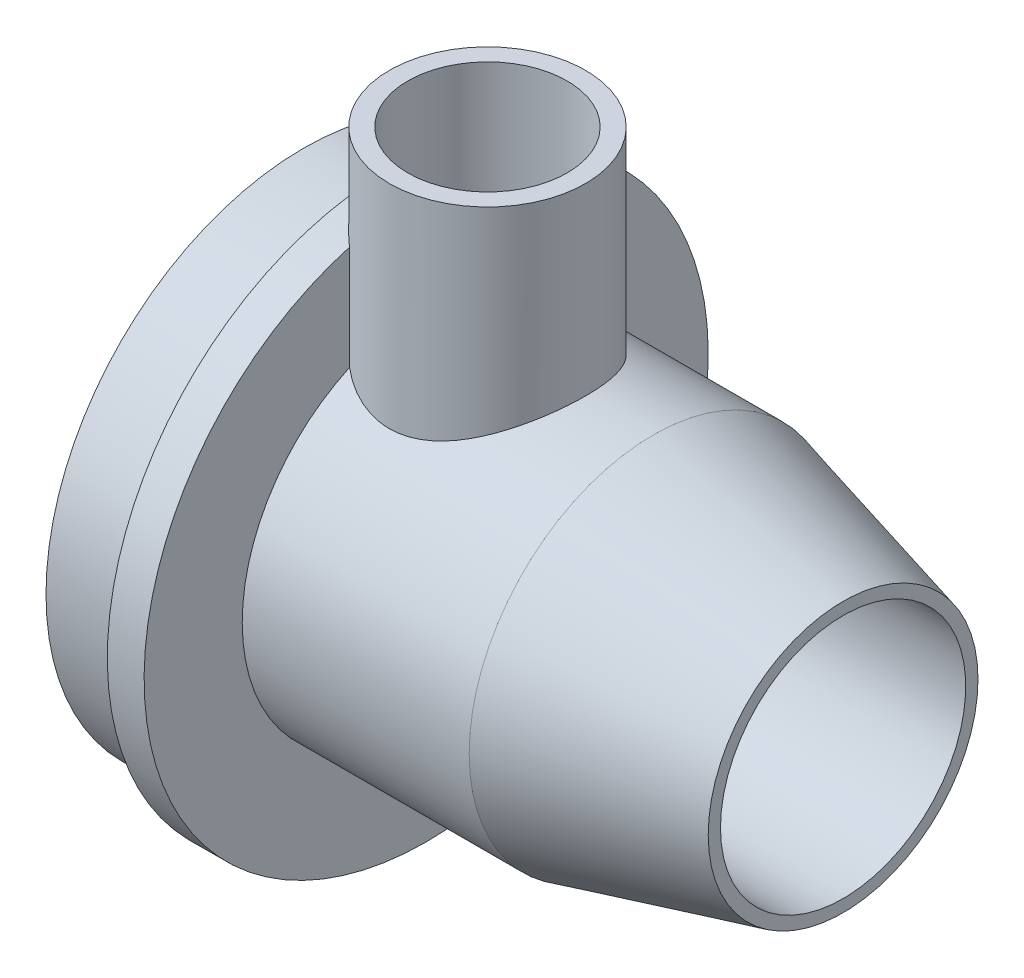
ISO-10303-21;
HEADER;
FILE_DESCRIPTION(('STEP AP214'),'2;1');
FILE_NAME('part.step','',(''),(''),'','','');
FILE_SCHEMA(('AUTOMOTIVE_DESIGN { 1 0 10303 214 1 1 1 1 }'));
ENDSEC;
DATA;
#1=APPLICATION_CONTEXT('core data for automotive mechanical design processes');
#2=APPLICATION_PROTOCOL_DEFINITION('international standard','automotive_design',2000,#1);
#3=PRODUCT_CONTEXT('',#1,'mechanical');
#4=PRODUCT('Part','Part','',(#3));
#5=PRODUCT_RELATED_PRODUCT_CATEGORY('part','',(#4));
#6=PRODUCT_DEFINITION_FORMATION('','',#4);
#7=PRODUCT_DEFINITION_CONTEXT('part definition',#1,'design');
#8=PRODUCT_DEFINITION('design','',#6,#7);
#9=PRODUCT_DEFINITION_SHAPE('','',#8);
#10=(LENGTH_UNIT() NAMED_UNIT(*) SI_UNIT(.MILLI.,.METRE.));
#11=(NAMED_UNIT(*) PLANE_ANGLE_UNIT() SI_UNIT($,.RADIAN.));
#12=(NAMED_UNIT(*) SI_UNIT($,.STERADIAN.) SOLID_ANGLE_UNIT());
#13=UNCERTAINTY_MEASURE_WITH_UNIT(LENGTH_MEASURE(1.E-05),#10,'distance_accuracy_value','');
#14=(GEOMETRIC_REPRESENTATION_CONTEXT(3) GLOBAL_UNCERTAINTY_ASSIGNED_CONTEXT((#13)) GLOBAL_UNIT_ASSIGNED_CONTEXT((#10,
#11,#12)) REPRESENTATION_CONTEXT('',''));
#15=CARTESIAN_POINT('',(0.,0.,0.));
#16=DIRECTION('',(0.,0.,1.));
#17=DIRECTION('',(1.,0.,0.));
#18=AXIS2_PLACEMENT_3D('',#15,#16,#17);
#19=CARTESIAN_POINT('',(0.,0.,0.));
#20=DIRECTION('',(-1.,0.,0.));
#21=DIRECTION('',(0.,0.,1.));
#22=AXIS2_PLACEMENT_3D('',#19,#20,#21);
#23=CYLINDRICAL_SURFACE('',#22,10.);
#24=CARTESIAN_POINT('',(15.,7.59934207678533,6.5));
#25=CARTESIAN_POINT('',(14.8400583388866,7.59933308957921,6.50000533290812));
#26=CARTESIAN_POINT('',(14.6801606960161,7.60440876007961,6.4940889906187));
#27=CARTESIAN_POINT('',(14.3618002704686,7.62444014081336,6.47056145597246));
#28=CARTESIAN_POINT('',(14.2033378716652,7.6393984195191,6.45294722334845));
#29=CARTESIAN_POINT('',(13.889058410543,7.67853067881419,6.40633145436978));
#30=CARTESIAN_POINT('',(13.7332450114755,7.70271648390633,6.37731530573233));
#31=CARTESIAN_POINT('',(13.4255273424417,7.75925539917608,6.30840207637399));
#32=CARTESIAN_POINT('',(13.2736250805977,7.79161261621205,6.26849952345804));
#33=CARTESIAN_POINT('',(12.8280196589145,7.8984181727404,6.13416653332013));
#34=CARTESIAN_POINT('',(12.541172245207,7.98304900878619,6.02461111426445));
#35=CARTESIAN_POINT('',(11.9905276331066,8.16942157827204,5.76935742545856));
#36=CARTESIAN_POINT('',(11.7267355725146,8.27116711096038,5.62365112724726));
#37=CARTESIAN_POINT('',(11.1869022818788,8.49831148055545,5.27521860588888));
#38=CARTESIAN_POINT('',(10.914740563034,8.62499065753323,5.06726341505492));
#39=CARTESIAN_POINT('',(10.5333391035706,8.81413274104114,4.72526874452397));
#40=CARTESIAN_POINT('',(10.4105964080678,8.87708111853059,4.60615903401213));
#41=CARTESIAN_POINT('',(10.1744558855033,9.00143225112035,4.35814571765003));
#42=CARTESIAN_POINT('',(10.0610599685492,9.06283468852041,4.22924012020609));
#43=CARTESIAN_POINT('',(9.82959753642803,9.19089526311716,3.9439926988569));
#44=CARTESIAN_POINT('',(9.71296786088546,9.25714354187224,3.78629649621849));
#45=CARTESIAN_POINT('',(9.4936087218348,9.38415440277926,3.45953064441056));
#46=CARTESIAN_POINT('',(9.39087290762277,9.44491948697295,3.29046624476665));
#47=CARTESIAN_POINT('',(9.20043705136551,9.55924343672469,2.94185207054994));
#48=CARTESIAN_POINT('',(9.11272928096877,9.61280600319529,2.76230774947945));
#49=CARTESIAN_POINT('',(8.95353737657258,9.71111677376885,2.39385443959847));
#50=CARTESIAN_POINT('',(8.88204998566356,9.75586674712426,2.20494734004974));
#51=CARTESIAN_POINT('',(8.76328834958455,9.83080311062833,1.84014998714219));
#52=CARTESIAN_POINT('',(8.71423379152516,9.86203991385596,1.6650545499179));
#53=CARTESIAN_POINT('',(8.63077479344198,9.91544242629414,1.31004079092333));
#54=CARTESIAN_POINT('',(8.59636939953026,9.93760872613158,1.13012278398836));
#55=CARTESIAN_POINT('',(8.54284230690193,9.97218473165847,0.767276619920836));
#56=CARTESIAN_POINT('',(8.52370570474272,9.98460395100775,0.584351576350739));
#57=CARTESIAN_POINT('',(8.50102509488454,9.99932986650836,0.21714027088872));
#58=CARTESIAN_POINT('',(8.49747905870439,10.001637878224,0.0328541892063414));
#59=CARTESIAN_POINT('',(8.50541580175361,9.9964805215795,-0.308471930731757));
#60=CARTESIAN_POINT('',(8.51479348982044,9.99038407192987,-0.46558715387275));
#61=CARTESIAN_POINT('',(8.54485093089928,9.97089851507622,-0.778276778394665));
#62=CARTESIAN_POINT('',(8.56553049023981,9.95750953283874,-0.933851206132505));
#63=CARTESIAN_POINT('',(8.61791228864645,9.92374140879486,-1.24235213929927));
#64=CARTESIAN_POINT('',(8.64961441447379,9.90336233880017,-1.39527867191402));
#65=CARTESIAN_POINT('',(8.72363964464192,9.85605852963022,-1.69750113673235));
#66=CARTESIAN_POINT('',(8.76596320396076,9.82913351005523,-1.84679691310884));
#67=CARTESIAN_POINT('',(8.8606778821224,9.76933609382537,-2.14068214636695));
#68=CARTESIAN_POINT('',(8.91305418574175,9.73647245332673,-2.28527816728467));
#69=CARTESIAN_POINT('',(9.02738159849289,9.66541119440049,-2.56929812137667));
#70=CARTESIAN_POINT('',(9.08933586539086,9.62721181723192,-2.7087203299261));
#71=CARTESIAN_POINT('',(9.28872044564588,9.50565872374065,-3.11822938693762));
#72=CARTESIAN_POINT('',(9.4397411302902,9.41530579247598,-3.37976862488136));
#73=CARTESIAN_POINT('',(9.79518915324102,9.20958096960604,-3.90822198875151));
#74=CARTESIAN_POINT('',(10.0039904545054,9.09248547626012,-4.17148732452209));
#75=CARTESIAN_POINT('',(10.4579185025726,8.85118138453479,-4.66167855786949));
#76=CARTESIAN_POINT('',(10.7031004734877,8.72696215166855,-4.88854809934169));
#77=CARTESIAN_POINT('',(11.1143417114117,8.53410371281988,-5.2142264041091));
#78=CARTESIAN_POINT('',(11.269505847833,8.46437158744599,-5.3263639479742));
#79=CARTESIAN_POINT('',(11.5900824957276,8.32805166262728,-5.53708492419104));
#80=CARTESIAN_POINT('',(11.7554971569723,8.26146452795472,-5.63566549928287));
#81=CARTESIAN_POINT('',(12.2659338103456,8.07005883757598,-5.90961623854633));
#82=CARTESIAN_POINT('',(12.6259876354545,7.95317964179406,-6.0638644158492));
#83=CARTESIAN_POINT('',(13.2740039333678,7.78847238667857,-6.27315375174698));
#84=CARTESIAN_POINT('',(13.5543201285043,7.7304855582467,-6.34383875830805));
#85=CARTESIAN_POINT('',(13.9829992388776,7.66578257737267,-6.42159167264554));
#86=CARTESIAN_POINT('',(14.1272110267282,7.64793000433307,-6.44279455108122));
#87=CARTESIAN_POINT('',(14.4175269490867,7.62026529072653,-6.4754952908673));
#88=CARTESIAN_POINT('',(14.5636311007887,7.61045322326851,-6.4869930639733));
#89=CARTESIAN_POINT('',(14.8571145467832,7.59926522554291,-6.5000953197134));
#90=CARTESIAN_POINT('',(15.0044965077321,7.59791872393359,-6.50166529065925));
#91=CARTESIAN_POINT('',(15.2988531034649,7.60379239681346,-6.49479495870881));
#92=CARTESIAN_POINT('',(15.4458277363757,7.61101261063159,-6.48635460985614));
#93=CARTESIAN_POINT('',(15.7383061861521,7.63372986487478,-6.45960332512041));
#94=CARTESIAN_POINT('',(15.883809184843,7.64923127655166,-6.44128717622315));
#95=CARTESIAN_POINT('',(16.1722762787987,7.68789646668548,-6.39508741297853));
#96=CARTESIAN_POINT('',(16.3152392865958,7.71106344755486,-6.36719979981922));
#97=CARTESIAN_POINT('',(16.7289884084171,7.78896597165338,-6.27205115720151));
#98=CARTESIAN_POINT('',(16.9952552275277,7.85304430511934,-6.19226991697732));
#99=CARTESIAN_POINT('',(17.5108079707125,7.9995455566642,-6.00180219294854));
#100=CARTESIAN_POINT('',(17.7600882638438,8.08197451961215,-5.89110552224685));
#101=CARTESIAN_POINT('',(18.2872707996264,8.27554981612725,-5.61681651719879));
#102=CARTESIAN_POINT('',(18.5611095183661,8.38915297718367,-5.44709608902296));
#103=CARTESIAN_POINT('',(18.9496680242987,8.56367391070938,-5.16486415092207));
#104=CARTESIAN_POINT('',(19.0755863125145,8.62258602983525,-5.06608140068346));
#105=CARTESIAN_POINT('',(19.3197900197044,8.74066089455742,-4.85952468842731));
#106=CARTESIAN_POINT('',(19.4380740409963,8.79982368394551,-4.75174908823274));
#107=CARTESIAN_POINT('',(19.6888629562091,8.92870171193571,-4.50568012610363));
#108=CARTESIAN_POINT('',(19.8196500930153,8.99822772882015,-4.36553147285596));
#109=CARTESIAN_POINT('',(20.0689533487128,9.13418738951029,-4.07339748647198));
#110=CARTESIAN_POINT('',(20.1874733685977,9.20062201266993,-3.92141594334945));
#111=CARTESIAN_POINT('',(20.4113164982854,9.32866147594229,-3.6062432818896));
#112=CARTESIAN_POINT('',(20.5166471217946,9.39026905835647,-3.44305862851229));
#113=CARTESIAN_POINT('',(20.7131094879957,9.50701734777073,-3.10618304495389));
#114=CARTESIAN_POINT('',(20.8042451748307,9.56215985007303,-2.93249505187241));
#115=CARTESIAN_POINT('',(20.9546338995105,9.65426705546742,-2.61099492721876));
#116=CARTESIAN_POINT('',(21.0166266443424,9.69266900482713,-2.46487041281238));
#117=CARTESIAN_POINT('',(21.130131041501,9.76353109384654,-2.16722174145912));
#118=CARTESIAN_POINT('',(21.1816447733907,9.79599241229748,-2.01569866288642));
#119=CARTESIAN_POINT('',(21.2735856682019,9.85426879104328,-1.70817494690689));
#120=CARTESIAN_POINT('',(21.3140197037471,9.88008797077881,-1.5521771517698));
#121=CARTESIAN_POINT('',(21.3833282220824,9.92452372320751,-1.2366139215033));
#122=CARTESIAN_POINT('',(21.4122025031771,9.94314017022676,-1.0770484241757));
#123=CARTESIAN_POINT('',(21.4580720513582,9.97278228140975,-0.754899513090811));
#124=CARTESIAN_POINT('',(21.4750224130959,9.9837792483812,-0.592307033115549));
#125=CARTESIAN_POINT('',(21.4966149443998,9.99779665879843,-0.265961145035699));
#126=CARTESIAN_POINT('',(21.5012571066073,10.0008170974753,-0.102207736237086));
#127=CARTESIAN_POINT('',(21.4981616691553,9.99880511165032,0.225136546629045));
#128=CARTESIAN_POINT('',(21.4904237113017,9.99377245414821,0.388727415856773));
#129=CARTESIAN_POINT('',(21.462686774327,9.97578115260216,0.714417518844692));
#130=CARTESIAN_POINT('',(21.4426881834072,9.96282275950618,0.876516799667241));
#131=CARTESIAN_POINT('',(21.3922746959773,9.93029843248308,1.18838578831391));
#132=CARTESIAN_POINT('',(21.3625525333329,9.91117290118954,1.33831405253896));
#133=CARTESIAN_POINT('',(21.2928951589597,9.86660139976376,1.63483978293567));
#134=CARTESIAN_POINT('',(21.2529564587026,9.8411532708094,1.78143609272721));
#135=CARTESIAN_POINT('',(21.1184791239239,9.75606941734948,2.21484548875929));
#136=CARTESIAN_POINT('',(21.009237389706,9.68766654997609,2.49553266947341));
#137=CARTESIAN_POINT('',(20.7469149229794,9.52709520213775,3.05364173656353));
#138=CARTESIAN_POINT('',(20.5913132269444,9.43360450996868,3.32947821136372));
#139=CARTESIAN_POINT('',(20.2448156152342,9.23245260673407,3.85232601036338));
#140=CARTESIAN_POINT('',(20.0538943380681,9.12478122922703,4.0993164121989));
#141=CARTESIAN_POINT('',(19.6084298120776,8.88520850046443,4.59791361894756));
#142=CARTESIAN_POINT('',(19.3486111797791,8.75214010393956,4.84428792076347));
#143=CARTESIAN_POINT('',(18.9308071312773,8.55489671497705,5.17983595837439));
#144=CARTESIAN_POINT('',(18.7867585983349,8.48950103615547,5.28607346360421));
#145=CARTESIAN_POINT('',(18.4896418086402,8.36119636444768,5.48676261222267));
#146=CARTESIAN_POINT('',(18.3365737265358,8.29828732345139,5.5812144837095));
#147=CARTESIAN_POINT('',(17.901796557072,8.13050187055213,5.82498906060909));
#148=CARTESIAN_POINT('',(17.6107809341675,8.03009153363817,5.96141684895743));
#149=CARTESIAN_POINT('',(17.1571761074203,7.89826054322528,6.1337379490359));
#150=CARTESIAN_POINT('',(17.003232280713,7.85746788029359,6.18576841269407));
#151=CARTESIAN_POINT('',(16.6901941004987,7.78354866077495,6.27852465101383));
#152=CARTESIAN_POINT('',(16.5311014749781,7.75041956202,6.31925417533529));
#153=CARTESIAN_POINT('',(16.1471829511986,7.68232544635211,6.40201593637922));
#154=CARTESIAN_POINT('',(15.9204097321533,7.65147126791074,6.4386305546737));
#155=CARTESIAN_POINT('',(15.4623930784164,7.60998815001292,6.48761624843018));
#156=CARTESIAN_POINT('',(15.2311505697444,7.59935506525751,6.49999229278512));
#157=CARTESIAN_POINT('',(15.,7.59934207678533,6.5));
#158=B_SPLINE_CURVE_WITH_KNOTS('',3,(#24,#25,#26,#27,#28,#29,#30,#31,#32,#33,#34,#35,#36,#37,
#38,#39,#40,#41,#42,#43,#44,#45,#46,#47,#48,#49,#50,#51,#52,#53,#54,#55,#56,#57,#58,#59,#60,#61,
#62,#63,#64,#65,#66,#67,#68,#69,#70,#71,#72,#73,#74,#75,#76,#77,#78,#79,#80,#81,#82,#83,#84,#85,
#86,#87,#88,#89,#90,#91,#92,#93,#94,#95,#96,#97,#98,#99,#100,#101,#102,#103,#104,#105,#106,#107,
#108,#109,#110,#111,#112,#113,#114,#115,#116,#117,#118,#119,#120,#121,#122,#123,#124,#125,#126,
#127,#128,#129,#130,#131,#132,#133,#134,#135,#136,#137,#138,#139,#140,#141,#142,#143,#144,#145,
#146,#147,#148,#149,#150,#151,#152,#153,#154,#155,#156,#157),.UNSPECIFIED.,.T.,.F.,(4,2,2,2,2,2,
2,2,2,2,2,2,2,2,2,2,2,2,2,2,2,2,2,2,2,2,2,2,2,2,2,2,2,2,2,2,2,2,2,2,2,2,2,2,2,2,2,2,2,2,2,2,2,2,
2,2,2,2,2,2,2,2,2,2,2,2,4),(0.,0.479561943544136,0.959248573444704,1.43955196787469,
1.92009723939922,2.87137244681851,3.82285910477633,4.91392044900865,5.46027562051428,
6.00674216975594,6.62699707182968,7.24696749822479,7.86661813419635,8.48614423944694,
9.0388234794243,9.59146672590004,10.1435698905321,10.6956012191556,11.1675695386058,
11.6395297705508,12.1114851540227,12.5834607575531,13.0547460554758,13.5261870644826,
14.4684001978245,15.5320051225146,16.5972413852958,17.2078120258858,17.818511153465,
19.036499683572,19.9172104803903,20.3572768553139,20.797347231531,21.2389465725974,
21.68054794101,22.1223826405085,22.564402156965,23.4166854677773,24.2692499452009,
25.2901088351369,25.8014185281055,26.3128215676937,26.9238371652709,27.5346578564944,
28.1451289781481,28.7554301731993,29.2448665061654,29.7342056153985,30.2232405018678,
30.7122839206763,31.2031593520636,31.6940350769298,32.1849250045621,32.6757993902365,
33.1373837709881,33.5991259747404,34.5218436119792,35.5087486827151,36.4963651782461,
37.6372556575653,38.2084322432565,38.7795977727277,39.7851152485985,40.2872273415425,
40.7891726335575,41.4823863162041,42.175457875586),.UNSPECIFIED.);
#159=CARTESIAN_POINT('',(15.,7.59934207678533,6.5));
#160=VERTEX_POINT('',#159);
#161=EDGE_CURVE('E129',#160,#160,#158,.T.);
#162=ORIENTED_EDGE('',*,*,#161,.F.);
#163=EDGE_LOOP('',(#162));
#164=FACE_BOUND('',#163,.T.);
#165=CARTESIAN_POINT('',(44.,0.,0.));
#166=DIRECTION('',(-1.,0.,0.));
#167=DIRECTION('',(0.,0.,1.));
#168=AXIS2_PLACEMENT_3D('',#165,#166,#167);
#169=CIRCLE('',#168,10.);
#170=CARTESIAN_POINT('',(44.,0.,10.));
#171=VERTEX_POINT('',#170);
#172=EDGE_CURVE('E133',#171,#171,#169,.T.);
#173=ORIENTED_EDGE('',*,*,#172,.F.);
#174=EDGE_LOOP('',(#173));
#175=FACE_BOUND('',#174,.T.);
#176=CARTESIAN_POINT('',(0.,0.,0.));
#177=DIRECTION('',(-1.,0.,0.));
#178=DIRECTION('',(0.,0.,1.));
#179=AXIS2_PLACEMENT_3D('',#176,#177,#178);
#180=CIRCLE('',#179,10.);
#181=CARTESIAN_POINT('',(0.,0.,10.));
#182=VERTEX_POINT('',#181);
#183=EDGE_CURVE('E11',#182,#182,#180,.T.);
#184=ORIENTED_EDGE('',*,*,#183,.T.);
#185=EDGE_LOOP('',(#184));
#186=FACE_BOUND('',#185,.T.);
#187=ADVANCED_FACE('F39',(#164,#175,#186),#23,.F.);
#188=CARTESIAN_POINT('',(0.,10.,0.));
#189=DIRECTION('',(1.,0.,0.));
#190=DIRECTION('',(0.,0.,-1.));
#191=AXIS2_PLACEMENT_3D('',#188,#189,#190);
#192=PLANE('',#191);
#193=ORIENTED_EDGE('',*,*,#183,.F.);
#194=EDGE_LOOP('',(#193));
#195=FACE_BOUND('',#194,.T.);
#196=CARTESIAN_POINT('',(0.,0.,0.));
#197=DIRECTION('',(-1.,0.,0.));
#198=DIRECTION('',(0.,0.,1.));
#199=AXIS2_PLACEMENT_3D('',#196,#197,#198);
#200=CIRCLE('',#199,21.);
#201=CARTESIAN_POINT('',(0.,0.,21.));
#202=VERTEX_POINT('',#201);
#203=EDGE_CURVE('E47',#202,#202,#200,.T.);
#204=ORIENTED_EDGE('',*,*,#203,.T.);
#205=EDGE_LOOP('',(#204));
#206=FACE_BOUND('',#205,.T.);
#207=ADVANCED_FACE('F104',(#195,#206),#192,.F.);
#208=CARTESIAN_POINT('',(0.,0.,0.));
#209=DIRECTION('',(-1.,0.,0.));
#210=DIRECTION('',(0.,0.,1.));
#211=AXIS2_PLACEMENT_3D('',#208,#209,#210);
#212=CYLINDRICAL_SURFACE('',#211,21.);
#213=ORIENTED_EDGE('',*,*,#203,.F.);
#214=EDGE_LOOP('',(#213));
#215=FACE_BOUND('',#214,.T.);
#216=CARTESIAN_POINT('',(7.,0.,0.));
#217=DIRECTION('',(-1.,0.,0.));
#218=DIRECTION('',(0.,0.,1.));
#219=AXIS2_PLACEMENT_3D('',#216,#217,#218);
#220=CIRCLE('',#219,21.);
#221=CARTESIAN_POINT('',(7.,0.,21.));
#222=VERTEX_POINT('',#221);
#223=EDGE_CURVE('E92',#222,#222,#220,.T.);
#224=ORIENTED_EDGE('',*,*,#223,.T.);
#225=EDGE_LOOP('',(#224));
#226=FACE_BOUND('',#225,.T.);
#227=ADVANCED_FACE('F106',(#215,#226),#212,.T.);
#228=CARTESIAN_POINT('',(7.,21.,0.));
#229=DIRECTION('',(1.,0.,0.));
#230=DIRECTION('',(0.,0.,-1.));
#231=AXIS2_PLACEMENT_3D('',#228,#229,#230);
#232=PLANE('',#231);
#233=ORIENTED_EDGE('',*,*,#223,.F.);
#234=EDGE_LOOP('',(#233));
#235=FACE_BOUND('',#234,.T.);
#236=CARTESIAN_POINT('',(7.,0.,0.));
#237=DIRECTION('',(-1.,0.,0.));
#238=DIRECTION('',(0.,0.,1.));
#239=AXIS2_PLACEMENT_3D('',#236,#237,#238);
#240=CIRCLE('',#239,23.);
#241=CARTESIAN_POINT('',(6.99999999999999,23.,0.));
#242=VERTEX_POINT('',#241);
#243=EDGE_CURVE('E88',#242,#242,#240,.T.);
#244=ORIENTED_EDGE('',*,*,#243,.T.);
#245=EDGE_LOOP('',(#244));
#246=FACE_BOUND('',#245,.T.);
#247=ADVANCED_FACE('F109',(#235,#246),#232,.F.);
#248=CARTESIAN_POINT('',(0.,0.,0.));
#249=DIRECTION('',(-1.,0.,0.));
#250=DIRECTION('',(0.,0.,1.));
#251=AXIS2_PLACEMENT_3D('',#248,#249,#250);
#252=CYLINDRICAL_SURFACE('',#251,23.);
#253=CARTESIAN_POINT('',(10.,0.,0.));
#254=DIRECTION('',(-1.,0.,0.));
#255=DIRECTION('',(0.,0.,1.));
#256=AXIS2_PLACEMENT_3D('',#253,#254,#255);
#257=CIRCLE('',#256,23.);
#258=CARTESIAN_POINT('',(10.,22.1359436211786,-6.2449979983984));
#259=VERTEX_POINT('',#258);
#260=CARTESIAN_POINT('',(10.,22.1359436211786,6.2449979983984));
#261=VERTEX_POINT('',#260);
#262=EDGE_CURVE('E80',#259,#261,#257,.T.);
#263=ORIENTED_EDGE('',*,*,#262,.T.);
#264=CARTESIAN_POINT('',(15.,21.5638586528478,8.));
#265=CARTESIAN_POINT('',(15.2172524623144,21.5638583332253,8.00000038098938));
#266=CARTESIAN_POINT('',(15.4344993605001,21.5671506923763,7.99114297750294));
#267=CARTESIAN_POINT('',(15.8673520160953,21.5802109536116,7.95580604083348));
#268=CARTESIAN_POINT('',(16.0829578268583,21.5899786442591,7.92932708304092));
#269=CARTESIAN_POINT('',(16.5109560078448,21.6156736362081,7.85901073380135));
#270=CARTESIAN_POINT('',(16.723348164999,21.6316013440834,7.81517219658195));
#271=CARTESIAN_POINT('',(17.1434049537001,21.6691120413029,7.7105554939039));
#272=CARTESIAN_POINT('',(17.3510695116667,21.6906951186022,7.649777064987));
#273=CARTESIAN_POINT('',(17.7597944932955,21.7387986695278,7.5119863339617));
#274=CARTESIAN_POINT('',(17.9608692660011,21.7653074424246,7.43501244712712));
#275=CARTESIAN_POINT('',(18.355735227976,21.8225290756649,7.26534495243762));
#276=CARTESIAN_POINT('',(18.5495236779248,21.8532434973872,7.17264550328038));
#277=CARTESIAN_POINT('',(18.9285598546372,21.9179997265161,6.97225699483963));
#278=CARTESIAN_POINT('',(19.1138089609129,21.9520409936861,6.86457036807893));
#279=CARTESIAN_POINT('',(19.4748179932234,22.0225484069049,6.63489210458057));
#280=CARTESIAN_POINT('',(19.6505744679684,22.0590154242862,6.51289531547078));
#281=CARTESIAN_POINT('',(19.9981468634721,22.134850460106,6.25042104412903));
#282=CARTESIAN_POINT('',(20.169549095199,22.1742761213751,6.10941212581042));
#283=CARTESIAN_POINT('',(20.4999910316604,22.2536327481855,5.81371303001372));
#284=CARTESIAN_POINT('',(20.6590304730284,22.2935637244704,5.65902256122546));
#285=CARTESIAN_POINT('',(20.9638376327515,22.3728785224634,5.33683743245363));
#286=CARTESIAN_POINT('',(21.1096006931651,22.4122621480614,5.16933831625575));
#287=CARTESIAN_POINT('',(21.3868157781293,22.4894129278876,4.82263723323901));
#288=CARTESIAN_POINT('',(21.5182727673876,22.5271806401155,4.64343936106024));
#289=CARTESIAN_POINT('',(21.769657420564,22.6011815774409,4.26896509041445));
#290=CARTESIAN_POINT('',(21.8891368502515,22.6373378920816,4.07337213874683));
#291=CARTESIAN_POINT('',(22.1110707170791,22.7058623912211,3.67221938684759));
#292=CARTESIAN_POINT('',(22.2135319109094,22.7382320775949,3.46666358420653));
#293=CARTESIAN_POINT('',(22.4006119744566,22.7982719774581,3.04692210288792));
#294=CARTESIAN_POINT('',(22.4852311503634,22.825942271593,2.83273657238178));
#295=CARTESIAN_POINT('',(22.6358405854677,22.8757733465418,2.3972911101926));
#296=CARTESIAN_POINT('',(22.7018317194983,22.8979343860823,2.17603151127418));
#297=CARTESIAN_POINT('',(22.8124097633703,22.9353688410072,1.73656180857398));
#298=CARTESIAN_POINT('',(22.8577084668609,22.9508699929001,1.51855009188768));
#299=CARTESIAN_POINT('',(22.9300043419956,22.9757222575067,1.07916510907058));
#300=CARTESIAN_POINT('',(22.9570019318997,22.9850735107721,0.857791919882245));
#301=CARTESIAN_POINT('',(22.9924171591973,22.9973575836148,0.413440025761279));
#302=CARTESIAN_POINT('',(23.0008392634865,23.000291946277,0.190461719757497));
#303=CARTESIAN_POINT('',(22.9990289263061,22.9996622068611,-0.255407154051752));
#304=CARTESIAN_POINT('',(22.9887969599798,22.996098270303,-0.478297723947332));
#305=CARTESIAN_POINT('',(22.9506249084669,22.9828661408971,-0.912716788614267));
#306=CARTESIAN_POINT('',(22.923463475898,22.9734664291723,-1.12432244651421));
#307=CARTESIAN_POINT('',(22.8523932571283,22.9490515294639,-1.54444962018612));
#308=CARTESIAN_POINT('',(22.8084785493476,22.9340343559797,-1.75297001834618));
#309=CARTESIAN_POINT('',(22.7043131495156,22.8987781947207,-2.16535790475943));
#310=CARTESIAN_POINT('',(22.6440679219629,22.8785409537879,-2.36922692475529));
#311=CARTESIAN_POINT('',(22.5077206052511,22.8333469483259,-2.77113341618647));
#312=CARTESIAN_POINT('',(22.4316125232349,22.8083884004555,-2.96916865130042));
#313=CARTESIAN_POINT('',(22.2630413759315,22.754017727408,-3.36069349223322));
#314=CARTESIAN_POINT('',(22.1703740668286,22.7245507355695,-3.55408748379861));
#315=CARTESIAN_POINT('',(21.9700575545746,22.6621412174888,-3.93244666544204));
#316=CARTESIAN_POINT('',(21.8624032312959,22.6291975044024,-4.1174089461417));
#317=CARTESIAN_POINT('',(21.6328782256201,22.5606533651492,-4.47778613019062));
#318=CARTESIAN_POINT('',(21.5110065737961,22.5250527578783,-4.65320038129772));
#319=CARTESIAN_POINT('',(21.253834569217,22.4520655291838,-4.99350012167113));
#320=CARTESIAN_POINT('',(21.118533682847,22.4146788368201,-5.15838519212906));
#321=CARTESIAN_POINT('',(20.8280608977944,22.3370929009618,-5.48487542538555));
#322=CARTESIAN_POINT('',(20.6722263670946,22.2968476482117,-5.64588069081751));
#323=CARTESIAN_POINT('',(20.3476438709638,22.2164934986882,-5.95422534058212));
#324=CARTESIAN_POINT('',(20.1788999133417,22.1763845636005,-6.10156893509209));
#325=CARTESIAN_POINT('',(19.8293764590195,22.0973728548208,-6.38179615882103));
#326=CARTESIAN_POINT('',(19.648590339902,22.0584707623404,-6.51467172395141));
#327=CARTESIAN_POINT('',(19.2762284720549,21.983014122012,-6.7649219890295));
#328=CARTESIAN_POINT('',(19.0846569747204,21.9464586611592,-6.88230273655953));
#329=CARTESIAN_POINT('',(18.6884479823416,21.876151370498,-7.10264825292005));
#330=CARTESIAN_POINT('',(18.4836422369139,21.8424586968307,-7.2053297997572));
#331=CARTESIAN_POINT('',(18.0654676877205,21.7796783530326,-7.39292897335588));
#332=CARTESIAN_POINT('',(17.8521025134386,21.7505887563828,-7.47785403651938));
#333=CARTESIAN_POINT('',(17.4182732988318,21.6979654335782,-7.62920189108275));
#334=CARTESIAN_POINT('',(17.1978104204194,21.6744308032637,-7.69562769385052));
#335=CARTESIAN_POINT('',(16.751425639254,21.6337262281564,-7.80932424241606));
#336=CARTESIAN_POINT('',(16.5255040493049,21.6165559195818,-7.85659608306035));
#337=CARTESIAN_POINT('',(16.0810892086049,21.5898580366352,-7.92965733807155));
#338=CARTESIAN_POINT('',(15.8627688524669,21.5799994600875,-7.95637948586874));
#339=CARTESIAN_POINT('',(15.4244723987499,21.566923837426,-7.99175551360671));
#340=CARTESIAN_POINT('',(15.2044963550621,21.5637065760727,-8.00040997910613));
#341=CARTESIAN_POINT('',(14.764625449631,21.5640217835615,-7.99956022517666));
#342=CARTESIAN_POINT('',(14.5447305804013,21.5675530345234,-7.99005928219029));
#343=CARTESIAN_POINT('',(14.1066788147249,21.5812441286127,-7.9530051465981));
#344=CARTESIAN_POINT('',(13.8885218931914,21.5914038758828,-7.92545221504883));
#345=CARTESIAN_POINT('',(13.4640038955902,21.617496255793,-7.85399493689286));
#346=CARTESIAN_POINT('',(13.257513679019,21.6331894572694,-7.81076692244077));
#347=CARTESIAN_POINT('',(12.848965565724,21.6699224848625,-7.70826964991308));
#348=CARTESIAN_POINT('',(12.6469092584788,21.6909641953791,-7.6489947376754));
#349=CARTESIAN_POINT('',(12.2486352261091,21.7377758981419,-7.51492737674751));
#350=CARTESIAN_POINT('',(12.0524161747165,21.7635448066492,-7.44013848421849));
#351=CARTESIAN_POINT('',(11.666868716231,21.8191052077049,-7.27558839989026));
#352=CARTESIAN_POINT('',(11.4775429660541,21.848898230878,-7.18582150793993));
#353=CARTESIAN_POINT('',(11.1007306189512,21.9127514805253,-6.98873407041612));
#354=CARTESIAN_POINT('',(10.9135169559932,21.9469210431317,-6.88092713231806));
#355=CARTESIAN_POINT('',(10.5486888680073,22.0177685314059,-6.65074204099797));
#356=CARTESIAN_POINT('',(10.3710777814635,22.054447319532,-6.52835886688671));
#357=CARTESIAN_POINT('',(10.0264939608717,22.1293350948953,-6.26981957994389));
#358=CARTESIAN_POINT('',(9.85952241092469,22.167544251683,-6.13366193846541));
#359=CARTESIAN_POINT('',(9.53716538486559,22.2445062493066,-5.84839841442134));
#360=CARTESIAN_POINT('',(9.38178021303931,22.2832591043896,-5.69929219201775));
#361=CARTESIAN_POINT('',(9.07551156503764,22.3623907785756,-5.38069059155073));
#362=CARTESIAN_POINT('',(8.92531128596021,22.4027459518407,-5.21053167796225));
#363=CARTESIAN_POINT('',(8.63979251272849,22.4818465442589,-4.857901987097));
#364=CARTESIAN_POINT('',(8.50446910204208,22.5205924925815,-4.67543530967211));
#365=CARTESIAN_POINT('',(8.24955210306919,22.59543519422,-4.29919815206329));
#366=CARTESIAN_POINT('',(8.12996470023032,22.6315309033407,-4.10542326984008));
#367=CARTESIAN_POINT('',(7.90755012884683,22.7000363776541,-3.70796318312004));
#368=CARTESIAN_POINT('',(7.80471588454016,22.7324476972057,-3.50428220994575));
#369=CARTESIAN_POINT('',(7.61711269197516,22.7925243715881,-3.08942080639035));
#370=CARTESIAN_POINT('',(7.5322499290175,22.8202142178338,-2.87828639001223));
#371=CARTESIAN_POINT('',(7.38069334106732,22.8702583204866,-2.44906935554424));
#372=CARTESIAN_POINT('',(7.31399217646233,22.8926147318311,-2.23098958418493));
#373=CARTESIAN_POINT('',(7.1993673918659,22.9313531443195,-1.78945419062191));
#374=CARTESIAN_POINT('',(7.15144142684038,22.9477358915599,-1.56599924348378));
#375=CARTESIAN_POINT('',(7.07484994843884,22.9740441673414,-1.11543996392859));
#376=CARTESIAN_POINT('',(7.04618351519983,22.9839700042731,-0.888335806333627));
#377=CARTESIAN_POINT('',(7.00937538267489,22.9967346516845,-0.443930287661831));
#378=CARTESIAN_POINT('',(7.00026320392018,22.9999084895867,-0.226718378062474));
#379=CARTESIAN_POINT('',(6.99974806665735,23.0000875902145,0.207727366473455));
#380=CARTESIAN_POINT('',(7.00834470248333,22.9970929942439,0.424961200793796));
#381=CARTESIAN_POINT('',(7.04316067689242,22.9850174474053,0.857816775471584));
#382=CARTESIAN_POINT('',(7.06937828433806,22.9759370944206,1.0734386720868));
#383=CARTESIAN_POINT('',(7.13918144294185,22.9519366413288,1.50152037867896));
#384=CARTESIAN_POINT('',(7.18276702274299,22.9370165315909,1.71398018344042));
#385=CARTESIAN_POINT('',(7.28591986605985,22.9020681663569,2.13027910350857));
#386=CARTESIAN_POINT('',(7.34517120941902,22.8821412365451,2.33420519812009));
#387=CARTESIAN_POINT('',(7.47952275557076,22.8375472275907,2.73630628984737));
#388=CARTESIAN_POINT('',(7.55462825217741,22.8128785653966,2.934479340776));
#389=CARTESIAN_POINT('',(7.7200608845409,22.7594242076382,3.32373286264335));
#390=CARTESIAN_POINT('',(7.81038468681591,22.7306394138971,3.51481487567194));
#391=CARTESIAN_POINT('',(8.00563577426979,22.6696389504691,3.88888179887722));
#392=CARTESIAN_POINT('',(8.11056868823184,22.6374219595108,4.07186355209706));
#393=CARTESIAN_POINT('',(8.33860666945263,22.5690469554298,4.43549897002048));
#394=CARTESIAN_POINT('',(8.46225562441458,22.532784996025,4.61579210932875));
#395=CARTESIAN_POINT('',(8.72372499683134,22.4583151532246,4.96548689577687));
#396=CARTESIAN_POINT('',(8.86155182282019,22.4201063938298,5.1348835608795));
#397=CARTESIAN_POINT('',(9.15047561681013,22.3427295988624,5.46174391643231));
#398=CARTESIAN_POINT('',(9.30157370849523,22.3035614822634,5.61920659431963));
#399=CARTESIAN_POINT('',(9.61613022092871,22.2252750868503,5.92127492961049));
#400=CARTESIAN_POINT('',(9.77958883478081,22.1861568088244,6.06588038607376));
#401=CARTESIAN_POINT('',(10.1253687251383,22.1072945150322,6.34742738002423));
#402=CARTESIAN_POINT('',(10.3082032514566,22.0675985420746,6.48375289102338));
#403=CARTESIAN_POINT('',(10.6851116562149,21.9905491305782,6.74045308343848));
#404=CARTESIAN_POINT('',(10.8791812696369,21.9531948141809,6.86083376144327));
#405=CARTESIAN_POINT('',(11.2774579746224,21.8819316027533,7.08483553260572));
#406=CARTESIAN_POINT('',(11.4816682457497,21.8480237986474,7.18845132527889));
#407=CARTESIAN_POINT('',(11.8987229316827,21.7847531122039,7.37797510848214));
#408=CARTESIAN_POINT('',(12.111563459807,21.7553882120174,7.46389096655543));
#409=CARTESIAN_POINT('',(12.5411291105296,21.7025648642017,7.61610624133352));
#410=CARTESIAN_POINT('',(12.7577440568708,21.6790224806957,7.68268717420333));
#411=CARTESIAN_POINT('',(13.1963930704705,21.6380527482113,7.79733199941992));
#412=CARTESIAN_POINT('',(13.4184270885678,21.6206253437806,7.8453960596832));
#413=CARTESIAN_POINT('',(13.8661156992509,21.5924942827882,7.92249194526338));
#414=CARTESIAN_POINT('',(14.0917689289107,21.5817881533861,7.95153077037233));
#415=CARTESIAN_POINT('',(14.5449501888691,21.5674706440818,7.99028422154771));
#416=CARTESIAN_POINT('',(14.7724781457282,21.5638589875787,7.99999960100149));
#417=CARTESIAN_POINT('',(15.,21.5638586528478,8.));
#418=B_SPLINE_CURVE_WITH_KNOTS('',3,(#264,#265,#266,#267,#268,#269,#270,#271,#272,#273,#274,
#275,#276,#277,#278,#279,#280,#281,#282,#283,#284,#285,#286,#287,#288,#289,#290,#291,#292,#293,
#294,#295,#296,#297,#298,#299,#300,#301,#302,#303,#304,#305,#306,#307,#308,#309,#310,#311,#312,
#313,#314,#315,#316,#317,#318,#319,#320,#321,#322,#323,#324,#325,#326,#327,#328,#329,#330,#331,
#332,#333,#334,#335,#336,#337,#338,#339,#340,#341,#342,#343,#344,#345,#346,#347,#348,#349,#350,
#351,#352,#353,#354,#355,#356,#357,#358,#359,#360,#361,#362,#363,#364,#365,#366,#367,#368,#369,
#370,#371,#372,#373,#374,#375,#376,#377,#378,#379,#380,#381,#382,#383,#384,#385,#386,#387,#388,
#389,#390,#391,#392,#393,#394,#395,#396,#397,#398,#399,#400,#401,#402,#403,#404,#405,#406,#407,
#408,#409,#410,#411,#412,#413,#414,#415,#416,#417),.UNSPECIFIED.,.T.,.F.,(4,2,2,2,2,2,2,2,2,2,2,
2,2,2,2,2,2,2,2,2,2,2,2,2,2,2,2,2,2,2,2,2,2,2,2,2,2,2,2,2,2,2,2,2,2,2,2,2,2,2,2,2,2,2,2,2,2,2,2,
2,2,2,2,2,2,2,2,2,2,2,2,2,2,2,2,2,4),(0.,0.651543510179756,1.30306574678075,1.95463099252539,
2.60620637232583,3.25625331011221,3.90654224042334,4.55672574715614,5.20714407512314,
5.88265790711338,6.55818612573723,7.23395044386675,7.90947949520097,8.60471613979345,
9.29967609379132,9.99462412048989,10.6895395047475,11.3583137938889,12.0270727981191,
12.695670966579,13.36425210522,14.0041459580183,14.6442661963163,15.2841725022123,
15.9243209991217,16.5729917488865,17.2218846553156,17.8708218332371,18.519784807207,
19.2019659875762,19.8839362335149,20.5662846661884,21.248365987825,21.9421991094335,
22.6357410696338,23.3291700668104,24.0225594217734,24.6822360229976,25.3418912443175,
26.0014274312295,26.6609540805526,27.2948761874471,27.9290219496563,28.5630225113777,
29.1972649062228,29.8527042165321,30.5083699541466,31.1641085354633,31.8198643319694,
32.5106286722567,33.2011640369568,33.8919700288537,34.5824834954687,35.2692982889522,
35.9558351079121,36.6422861506379,37.3287044051415,37.9801824191097,38.6316455094654,
39.2830446074734,39.9344447797639,40.5735964249539,41.2129618259496,41.852187359294,
42.4916598666535,43.1557391811786,43.8201199960302,44.4845571186314,45.1490046236252,
45.8426505847003,46.5360349317437,47.2296380766699,47.922932249666,48.6055579127473,
49.288177385431,49.9705455665214,50.6528871427486),.UNSPECIFIED.);
#419=EDGE_CURVE('E67',#242,#261,#418,.T.);
#420=ORIENTED_EDGE('',*,*,#419,.F.);
#421=ORIENTED_EDGE('',*,*,#243,.F.);
#422=EDGE_CURVE('E60',#259,#242,#418,.T.);
#423=ORIENTED_EDGE('',*,*,#422,.F.);
#424=EDGE_LOOP('',(#263,#420,#421,#423));
#425=FACE_BOUND('',#424,.T.);
#426=ADVANCED_FACE('F86',(#425),#252,.T.);
#427=CARTESIAN_POINT('',(10.,23.,0.));
#428=DIRECTION('',(-1.,0.,0.));
#429=DIRECTION('',(0.,0.,1.));
#430=AXIS2_PLACEMENT_3D('',#427,#428,#429);
#431=PLANE('',#430);
#432=CARTESIAN_POINT('',(10.,0.,0.));
#433=DIRECTION('',(-1.,0.,0.));
#434=DIRECTION('',(0.,0.,1.));
#435=AXIS2_PLACEMENT_3D('',#432,#433,#434);
#436=CIRCLE('',#435,15.);
#437=CARTESIAN_POINT('',(10.,13.6381816969858,-6.2449979983984));
#438=VERTEX_POINT('',#437);
#439=CARTESIAN_POINT('',(10.,13.6381816969858,6.2449979983984));
#440=VERTEX_POINT('',#439);
#441=EDGE_CURVE('E82',#438,#440,#436,.T.);
#442=ORIENTED_EDGE('',*,*,#441,.T.);
#443=DIRECTION('',(0.,1.,0.));
#444=VECTOR('',#443,1.);
#445=CARTESIAN_POINT('',(10.,-23.002,6.2449979983984));
#446=LINE('',#445,#444);
#447=EDGE_CURVE('E54',#261,#440,#446,.F.);
#448=ORIENTED_EDGE('',*,*,#447,.F.);
#449=ORIENTED_EDGE('',*,*,#262,.F.);
#450=DIRECTION('',(0.,1.,0.));
#451=VECTOR('',#450,1.);
#452=CARTESIAN_POINT('',(10.,-23.002,-6.2449979983984));
#453=LINE('',#452,#451);
#454=EDGE_CURVE('E147',#438,#259,#453,.T.);
#455=ORIENTED_EDGE('',*,*,#454,.F.);
#456=EDGE_LOOP('',(#442,#448,#449,#455));
#457=FACE_BOUND('',#456,.T.);
#458=ADVANCED_FACE('F78',(#457),#431,.F.);
#459=CARTESIAN_POINT('',(0.,0.,0.));
#460=DIRECTION('',(-1.,0.,0.));
#461=DIRECTION('',(0.,0.,1.));
#462=AXIS2_PLACEMENT_3D('',#459,#460,#461);
#463=CYLINDRICAL_SURFACE('',#462,15.);
#464=ORIENTED_EDGE('',*,*,#441,.F.);
#465=CARTESIAN_POINT('',(15.,12.6885775404495,8.));
#466=CARTESIAN_POINT('',(15.2062807278142,12.6885765278676,8.00000082721682));
#467=CARTESIAN_POINT('',(15.4125521905369,12.6936244616965,7.99201174654624));
#468=CARTESIAN_POINT('',(15.8234599547187,12.7136132089408,7.96017537563484));
#469=CARTESIAN_POINT('',(16.0280956119096,12.728557742943,7.93632212130752));
#470=CARTESIAN_POINT('',(16.4343029929785,12.7677833039786,7.87306095334852));
#471=CARTESIAN_POINT('',(16.6358703345715,12.7920765809839,7.83363262937667));
#472=CARTESIAN_POINT('',(17.0343271601007,12.8491080572074,7.73973085972861));
#473=CARTESIAN_POINT('',(17.2312145301626,12.8818499962724,7.68525075053985));
#474=CARTESIAN_POINT('',(17.617774028385,12.9544169307915,7.56228385666899));
#475=CARTESIAN_POINT('',(17.8074842506989,12.9941952837498,7.49388888707304));
#476=CARTESIAN_POINT('',(18.1801055790204,13.0797616840841,7.3435222093617));
#477=CARTESIAN_POINT('',(18.363014165682,13.125551930383,7.26154553068372));
#478=CARTESIAN_POINT('',(18.7211610934478,13.2218490629248,7.0846895469615));
#479=CARTESIAN_POINT('',(18.8964005143577,13.2723552820083,6.9898120661042));
#480=CARTESIAN_POINT('',(19.2385247754625,13.3767912234906,6.78781438160603));
#481=CARTESIAN_POINT('',(19.4054093312025,13.4307210623105,6.68069376153462));
#482=CARTESIAN_POINT('',(19.9234942274333,13.6062056303797,6.32032913923123));
#483=CARTESIAN_POINT('',(20.2582015924694,13.7320055318079,6.04463813970563));
#484=CARTESIAN_POINT('',(20.7236252823563,13.9190407271586,5.59347847675013));
#485=CARTESIAN_POINT('',(20.8727421303169,13.98114670239,5.43671146220673));
#486=CARTESIAN_POINT('',(21.1582050160213,14.1034342850554,5.11109924634898));
#487=CARTESIAN_POINT('',(21.2945489901401,14.1636155805014,4.94225210107677));
#488=CARTESIAN_POINT('',(21.5638830240319,14.2852717014807,4.57935642046023));
#489=CARTESIAN_POINT('',(21.6957394295338,14.3464672523525,4.3843718855975));
#490=CARTESIAN_POINT('',(21.9423529059423,14.463211026805,3.98237404529215));
#491=CARTESIAN_POINT('',(22.0571173837356,14.5187616932942,3.77536600468325));
#492=CARTESIAN_POINT('',(22.2684185508285,14.6226346324678,3.35057394862973));
#493=CARTESIAN_POINT('',(22.364960678775,14.6709590609995,3.13279317298695));
#494=CARTESIAN_POINT('',(22.5386923688465,14.7589385631076,2.68795642145345));
#495=CARTESIAN_POINT('',(22.6158843238,14.7985947085199,2.4609015964273));
#496=CARTESIAN_POINT('',(22.744553769798,14.8652391133082,2.01763632127899));
#497=CARTESIAN_POINT('',(22.7975824828434,14.8929813683054,1.80198906047704));
#498=CARTESIAN_POINT('',(22.8856372968399,14.9392726976933,1.36607301961615));
#499=CARTESIAN_POINT('',(22.9206642676045,14.9578222162598,1.14580446338573));
#500=CARTESIAN_POINT('',(22.9722035929783,14.9851777815142,0.702641151594255));
#501=CARTESIAN_POINT('',(22.9887268856328,14.9939895843995,0.479748026324828));
#502=CARTESIAN_POINT('',(23.0030487482147,15.0016248937834,0.0331964913150459));
#503=CARTESIAN_POINT('',(23.0008486800895,15.0004491267833,-0.190461861579219));
#504=CARTESIAN_POINT('',(22.9789062156974,14.9887583249268,-0.614471057868572));
#505=CARTESIAN_POINT('',(22.9609184604038,14.9791774779261,-0.814941475222453));
#506=CARTESIAN_POINT('',(22.9099877831977,14.9521717230929,-1.2134408868588));
#507=CARTESIAN_POINT('',(22.8770447511722,14.9347467575056,-1.41146986315436));
#508=CARTESIAN_POINT('',(22.796580461212,14.8924644313708,-1.80372417544334));
#509=CARTESIAN_POINT('',(22.7490593478838,14.8676071445479,-1.99794954914608));
#510=CARTESIAN_POINT('',(22.6399461839264,14.811029806268,-2.3813778812323));
#511=CARTESIAN_POINT('',(22.5783535989998,14.7793094942225,-2.57058064860158));
#512=CARTESIAN_POINT('',(22.4408878293681,14.7092919056294,-2.9450691030465));
#513=CARTESIAN_POINT('',(22.3648554927688,14.6709217934463,-3.1302827348265));
#514=CARTESIAN_POINT('',(22.1996629526356,14.5886953872264,-3.49352300483046));
#515=CARTESIAN_POINT('',(22.1104984168043,14.5448372834282,-3.67154724649229));
#516=CARTESIAN_POINT('',(21.8243650223232,14.4063856676657,-4.19348838897107));
#517=CARTESIAN_POINT('',(21.6086725891169,14.3048709118572,-4.52549971196681));
#518=CARTESIAN_POINT('',(21.1081019673324,14.0802637401868,-5.18456327218351));
#519=CARTESIAN_POINT('',(20.8183719820867,13.9560254510799,-5.50754077984474));
#520=CARTESIAN_POINT('',(20.3480315723057,13.7688338304178,-5.95360340169782));
#521=CARTESIAN_POINT('',(20.1851468423618,13.7062463622372,-6.0959904466473));
#522=CARTESIAN_POINT('',(19.8480258548273,13.5822961853233,-6.36737369068614));
#523=CARTESIAN_POINT('',(19.6737877330341,13.5209336798982,-6.49636768160105));
#524=CARTESIAN_POINT('',(19.3004300754052,13.3962802284654,-6.74990405312194));
#525=CARTESIAN_POINT('',(19.1004340894718,13.3332248820359,-6.87327380044759));
#526=CARTESIAN_POINT('',(18.6891810872363,13.2125488792136,-7.10248719563441));
#527=CARTESIAN_POINT('',(18.4779291941893,13.154925782791,-7.20833872853441));
#528=CARTESIAN_POINT('',(18.0453911986685,13.0472441446601,-7.40146247077417));
#529=CARTESIAN_POINT('',(17.8241117090905,12.9971807093155,-7.48874671446712));
#530=CARTESIAN_POINT('',(17.3728854274168,12.9066564433152,-7.64370915928796));
#531=CARTESIAN_POINT('',(17.1429399766908,12.8661941335559,-7.71139038071889));
#532=CARTESIAN_POINT('',(16.695173176445,12.7995566447755,-7.82145437166402));
#533=CARTESIAN_POINT('',(16.4778796048528,12.7724893252617,-7.86544291947862));
#534=CARTESIAN_POINT('',(16.0393230446094,12.7292029555451,-7.93530677234208));
#535=CARTESIAN_POINT('',(15.8180603009447,12.7129832381527,-7.96118319139483));
#536=CARTESIAN_POINT('',(15.3737830861565,12.6921440125064,-7.99436472687623));
#537=CARTESIAN_POINT('',(15.1507702196287,12.6875148968984,-8.00168522421754));
#538=CARTESIAN_POINT('',(14.7049912170028,12.6900500928086,-7.99766461379362));
#539=CARTESIAN_POINT('',(14.4822250599286,12.6972133099323,-7.98632523776911));
#540=CARTESIAN_POINT('',(14.0685944326207,12.7212695878385,-7.94793800232505));
#541=CARTESIAN_POINT('',(13.877428255546,12.7367415686164,-7.92318043725929));
#542=CARTESIAN_POINT('',(13.498120027255,12.7757602066192,-7.86010987830084));
#543=CARTESIAN_POINT('',(13.3099789763214,12.7993094794345,-7.82179249333659));
#544=CARTESIAN_POINT('',(12.9379596234833,12.8537208452295,-7.73205060893869));
#545=CARTESIAN_POINT('',(12.7540810067234,12.8845823961677,-7.68062708101061));
#546=CARTESIAN_POINT('',(12.3914756465384,12.9527088743853,-7.56517167807626));
#547=CARTESIAN_POINT('',(12.2127509948307,12.9899763599403,-7.50113476428877));
#548=CARTESIAN_POINT('',(11.8536291974278,13.0716388473629,-7.35794410875103));
#549=CARTESIAN_POINT('',(11.6735024193768,13.1162747460405,-7.27825059129718));
#550=CARTESIAN_POINT('',(11.3205301449079,13.2102058334668,-7.1063390899348));
#551=CARTESIAN_POINT('',(11.1476870969663,13.2595025712086,-7.01411693775347));
#552=CARTESIAN_POINT('',(10.80993506778,13.3615387544223,-6.81773611086282));
#553=CARTESIAN_POINT('',(10.6450279439668,13.4142789991174,-6.7135746608251));
#554=CARTESIAN_POINT('',(10.3237397234439,13.5220005778033,-6.49387939192664));
#555=CARTESIAN_POINT('',(10.1673592142852,13.5769820657783,-6.37834479090124));
#556=CARTESIAN_POINT('',(9.84126310749805,13.6962134405586,-6.11858240062042));
#557=CARTESIAN_POINT('',(9.67297661508524,13.7606355432632,-5.97263494643755));
#558=CARTESIAN_POINT('',(9.34909568951298,13.8892269606575,-5.66717190397729));
#559=CARTESIAN_POINT('',(9.19350179395305,13.9533962645304,-5.50765574157632));
#560=CARTESIAN_POINT('',(8.89575652099994,14.0799012133675,-5.17570667470744));
#561=CARTESIAN_POINT('',(8.75361127286622,14.1422360134202,-5.00326794429017));
#562=CARTESIAN_POINT('',(8.48371509791509,14.2634999947603,-4.64630001674158));
#563=CARTESIAN_POINT('',(8.35596603150284,14.3224287354076,-4.46176926183108));
#564=CARTESIAN_POINT('',(8.11079706126083,14.4377604357269,-4.07354485209451));
#565=CARTESIAN_POINT('',(7.99403497034841,14.4939538454569,-3.86937210530987));
#566=CARTESIAN_POINT('',(7.77838846080179,14.5994119794807,-3.45019516311609));
#567=CARTESIAN_POINT('',(7.67949554777388,14.6486799933833,-3.2351961766117));
#568=CARTESIAN_POINT('',(7.5007106400471,14.7388392730691,-2.7958660338929));
#569=CARTESIAN_POINT('',(7.42080837788382,14.7797350637035,-2.57153999786994));
#570=CARTESIAN_POINT('',(7.28101763497864,14.8519055817779,-2.11523636390425));
#571=CARTESIAN_POINT('',(7.22112638342336,14.8831816411609,-1.88325983017466));
#572=CARTESIAN_POINT('',(7.12714248736603,14.9325301276959,-1.43696201236957));
#573=CARTESIAN_POINT('',(7.09108421315627,14.9516024544314,-1.22316354703815));
#574=CARTESIAN_POINT('',(7.03641876585113,14.980590276506,-0.792732859071633));
#575=CARTESIAN_POINT('',(7.01781041670243,14.9905063889356,-0.576100828405125));
#576=CARTESIAN_POINT('',(6.99830784829529,15.0009003023475,-0.141899650138892));
#577=CARTESIAN_POINT('',(6.99740678374335,15.0013817505881,0.0756691028066763));
#578=CARTESIAN_POINT('',(7.01331464580508,14.9929015247902,0.509967983611449));
#579=CARTESIAN_POINT('',(7.03012283806224,14.9839402423169,0.726698145870781));
#580=CARTESIAN_POINT('',(7.07912557629477,14.9579364778125,1.13993624878349));
#581=CARTESIAN_POINT('',(7.10995534290214,14.9416116877612,1.33665343467825));
#582=CARTESIAN_POINT('',(7.18601479277237,14.9015877717357,1.72658766317705));
#583=CARTESIAN_POINT('',(7.23124933079464,14.8778861596536,1.91980350250514));
#584=CARTESIAN_POINT('',(7.33561903616672,14.8236550798794,2.30138685131234));
#585=CARTESIAN_POINT('',(7.39474992219062,14.7931277152739,2.48975583426772));
#586=CARTESIAN_POINT('',(7.52637106048317,14.7258931428121,2.86070279929688));
#587=CARTESIAN_POINT('',(7.59886643617933,14.6891835654033,3.04327852889162));
#588=CARTESIAN_POINT('',(7.75951664727418,14.6088870094687,3.40831874929691));
#589=CARTESIAN_POINT('',(7.84815461728315,14.5650946183864,3.59052521056868));
#590=CARTESIAN_POINT('',(8.03842246639471,14.4726171787796,3.94680147694489));
#591=CARTESIAN_POINT('',(8.14005708788577,14.4239303457008,4.1208682801224));
#592=CARTESIAN_POINT('',(8.35559356809658,14.3226773019175,4.46007274030208));
#593=CARTESIAN_POINT('',(8.46949708456935,14.27011056727,4.62520918610965));
#594=CARTESIAN_POINT('',(8.70888250863408,14.1621589491846,4.94589577335682));
#595=CARTESIAN_POINT('',(8.83436535335322,14.1067738378156,5.10144513720167));
#596=CARTESIAN_POINT('',(9.11072930311086,13.9880757213701,5.41899884131155));
#597=CARTESIAN_POINT('',(9.26288504899367,13.9245623740845,5.5798208931335));
#598=CARTESIAN_POINT('',(9.57987546852364,13.7969814658701,5.88822197092355));
#599=CARTESIAN_POINT('',(9.74471127657023,13.7329138558113,6.03579980945654));
#600=CARTESIAN_POINT('',(10.0864794768472,13.6057891395714,6.31714795862603));
#601=CARTESIAN_POINT('',(10.2634251123246,13.5427332358677,6.4509027380205));
#602=CARTESIAN_POINT('',(10.6284699577914,13.4194175576809,6.70365634186985));
#603=CARTESIAN_POINT('',(10.81656852891,13.3591576233888,6.82265601033328));
#604=CARTESIAN_POINT('',(11.2135816131552,13.2400605704134,7.0511191804652));
#605=CARTESIAN_POINT('',(11.4230717467018,13.1814769115307,7.1597181585176));
#606=CARTESIAN_POINT('',(11.8524556356397,13.0714949582071,7.35859675792892));
#607=CARTESIAN_POINT('',(12.0723511524838,13.0200978861982,7.4488732638284));
#608=CARTESIAN_POINT('',(12.5204548842902,12.926727469513,7.60975396300028));
#609=CARTESIAN_POINT('',(12.7486376174314,12.8847276803626,7.68041349816538));
#610=CARTESIAN_POINT('',(13.2119704389893,12.8119002549363,7.80129547673929));
#611=CARTESIAN_POINT('',(13.4471158061931,12.7810652276082,7.85153144322959));
#612=CARTESIAN_POINT('',(13.9011687847857,12.7342469976794,7.92721566236378));
#613=CARTESIAN_POINT('',(14.1196655269727,12.7171886311339,7.95446803384319));
#614=CARTESIAN_POINT('',(14.5587783252632,12.6943542313888,7.99086010160622));
#615=CARTESIAN_POINT('',(14.7793944609155,12.6885786233484,7.99999911533853));
#616=CARTESIAN_POINT('',(15.,12.6885775404495,8.));
#617=B_SPLINE_CURVE_WITH_KNOTS('',3,(#465,#466,#467,#468,#469,#470,#471,#472,#473,#474,#475,
#476,#477,#478,#479,#480,#481,#482,#483,#484,#485,#486,#487,#488,#489,#490,#491,#492,#493,#494,
#495,#496,#497,#498,#499,#500,#501,#502,#503,#504,#505,#506,#507,#508,#509,#510,#511,#512,#513,
#514,#515,#516,#517,#518,#519,#520,#521,#522,#523,#524,#525,#526,#527,#528,#529,#530,#531,#532,
#533,#534,#535,#536,#537,#538,#539,#540,#541,#542,#543,#544,#545,#546,#547,#548,#549,#550,#551,
#552,#553,#554,#555,#556,#557,#558,#559,#560,#561,#562,#563,#564,#565,#566,#567,#568,#569,#570,
#571,#572,#573,#574,#575,#576,#577,#578,#579,#580,#581,#582,#583,#584,#585,#586,#587,#588,#589,
#590,#591,#592,#593,#594,#595,#596,#597,#598,#599,#600,#601,#602,#603,#604,#605,#606,#607,#608,
#609,#610,#611,#612,#613,#614,#615,#616),.UNSPECIFIED.,.T.,.F.,(4,2,2,2,2,2,2,2,2,2,2,2,2,2,2,2,
2,2,2,2,2,2,2,2,2,2,2,2,2,2,2,2,2,2,2,2,2,2,2,2,2,2,2,2,2,2,2,2,2,2,2,2,2,2,2,2,2,2,2,2,2,2,2,2,
2,2,2,2,2,2,2,2,2,2,2,4),(0.,0.618612409650024,1.23745751626331,1.85711629277478,
2.47704983661099,3.09301829929052,3.70921269086573,4.32532004234234,4.94144835595199,
6.28932977416371,6.96411577792085,7.63901061484623,8.36770205136597,9.09607678055244,
9.82423377390031,10.5523006794077,11.2227676082844,11.893202138292,12.5632401460203,
13.2332294152304,13.8370243737463,14.4408237779643,15.0446171930172,15.6484335380709,
16.2593380665151,16.8704445849759,18.0919304974033,19.4399210054334,20.1150149937977,
20.7902201118518,21.5191974534642,22.247845780935,22.9760203876177,23.7040827422555,
24.3731385063228,25.0421531158554,25.7106130008442,26.3790108525116,26.9584945190621,
27.5381660115756,28.1177945478678,28.6976551048499,29.3029446478204,29.9084360658682,
30.5140685188859,31.1197426521452,31.8146386998427,32.5095641648474,33.2048048336834,
33.900135245042,34.6246245718508,35.3487685900283,36.0725201981181,36.796171550777,
37.4482560471201,38.1002965924857,38.7520850666368,39.4038465138906,40.0025200642457,
40.6013955961121,41.2000868617385,41.7990081214938,42.4202632353426,43.041745691238,
43.6633122264161,44.2849291098185,44.9751514824991,45.665435676684,46.3564872122069,
47.0474992005699,47.7759050365521,48.5044346233654,49.2308875558424,49.9568586947104,
50.6184046538861,51.2799755411001),.UNSPECIFIED.);
#618=EDGE_CURVE('E84',#440,#438,#617,.T.);
#619=ORIENTED_EDGE('',*,*,#618,.F.);
#620=EDGE_LOOP('',(#464,#619));
#621=FACE_BOUND('',#620,.T.);
#622=CARTESIAN_POINT('',(28.5080666151703,0.,0.));
#623=DIRECTION('',(-1.,0.,0.));
#624=DIRECTION('',(0.,0.,1.));
#625=AXIS2_PLACEMENT_3D('',#622,#623,#624);
#626=CIRCLE('',#625,15.);
#627=CARTESIAN_POINT('',(28.5080666151703,0.,15.));
#628=VERTEX_POINT('',#627);
#629=EDGE_CURVE('E94',#628,#628,#626,.T.);
#630=ORIENTED_EDGE('',*,*,#629,.T.);
#631=EDGE_LOOP('',(#630));
#632=FACE_BOUND('',#631,.T.);
#633=ADVANCED_FACE('F152',(#621,#632),#463,.T.);
#634=CARTESIAN_POINT('',(44.,0.,0.));
#635=DIRECTION('',(-1.,0.,0.));
#636=DIRECTION('',(0.,0.,1.));
#637=AXIS2_PLACEMENT_3D('',#634,#635,#636);
#638=CONICAL_SURFACE('',#637,11.,0.252680255142078);
#639=ORIENTED_EDGE('',*,*,#629,.F.);
#640=EDGE_LOOP('',(#639));
#641=FACE_BOUND('',#640,.T.);
#642=CARTESIAN_POINT('',(44.,0.,0.));
#643=DIRECTION('',(-1.,0.,0.));
#644=DIRECTION('',(0.,0.,1.));
#645=AXIS2_PLACEMENT_3D('',#642,#643,#644);
#646=CIRCLE('',#645,11.);
#647=CARTESIAN_POINT('',(44.,0.,11.));
#648=VERTEX_POINT('',#647);
#649=EDGE_CURVE('E137',#648,#648,#646,.T.);
#650=ORIENTED_EDGE('',*,*,#649,.T.);
#651=EDGE_LOOP('',(#650));
#652=FACE_BOUND('',#651,.T.);
#653=ADVANCED_FACE('F154',(#641,#652),#638,.T.);
#654=CARTESIAN_POINT('',(44.,10.,0.));
#655=DIRECTION('',(-1.,0.,0.));
#656=DIRECTION('',(0.,0.,1.));
#657=AXIS2_PLACEMENT_3D('',#654,#655,#656);
#658=PLANE('',#657);
#659=ORIENTED_EDGE('',*,*,#649,.F.);
#660=EDGE_LOOP('',(#659));
#661=FACE_BOUND('',#660,.T.);
#662=ORIENTED_EDGE('',*,*,#172,.T.);
#663=EDGE_LOOP('',(#662));
#664=FACE_BOUND('',#663,.T.);
#665=ADVANCED_FACE('F157',(#661,#664),#658,.F.);
#666=CARTESIAN_POINT('',(15.,30.,0.));
#667=DIRECTION('',(0.,1.,0.));
#668=DIRECTION('',(0.,0.,1.));
#669=AXIS2_PLACEMENT_3D('',#666,#667,#668);
#670=PLANE('',#669);
#671=CARTESIAN_POINT('',(15.,30.,0.));
#672=DIRECTION('',(0.,1.,0.));
#673=DIRECTION('',(0.,0.,1.));
#674=AXIS2_PLACEMENT_3D('',#671,#672,#673);
#675=CIRCLE('',#674,6.5);
#676=CARTESIAN_POINT('',(15.,30.,6.5));
#677=VERTEX_POINT('',#676);
#678=EDGE_CURVE('E261',#677,#677,#675,.T.);
#679=ORIENTED_EDGE('',*,*,#678,.F.);
#680=EDGE_LOOP('',(#679));
#681=FACE_BOUND('',#680,.T.);
#682=CARTESIAN_POINT('',(15.,30.,0.));
#683=DIRECTION('',(0.,1.,0.));
#684=DIRECTION('',(0.,0.,1.));
#685=AXIS2_PLACEMENT_3D('',#682,#683,#684);
#686=CIRCLE('',#685,8.);
#687=CARTESIAN_POINT('',(15.,30.,8.));
#688=VERTEX_POINT('',#687);
#689=EDGE_CURVE('E138',#688,#688,#686,.T.);
#690=ORIENTED_EDGE('',*,*,#689,.T.);
#691=EDGE_LOOP('',(#690));
#692=FACE_BOUND('',#691,.T.);
#693=ADVANCED_FACE('F162',(#681,#692),#670,.T.);
#694=CARTESIAN_POINT('',(15.,-23.002,0.));
#695=DIRECTION('',(0.,1.,0.));
#696=DIRECTION('',(0.,0.,1.));
#697=AXIS2_PLACEMENT_3D('',#694,#695,#696);
#698=CYLINDRICAL_SURFACE('',#697,8.);
#699=ORIENTED_EDGE('',*,*,#689,.F.);
#700=EDGE_LOOP('',(#699));
#701=FACE_BOUND('',#700,.T.);
#702=ORIENTED_EDGE('',*,*,#454,.T.);
#703=ORIENTED_EDGE('',*,*,#422,.T.);
#704=ORIENTED_EDGE('',*,*,#419,.T.);
#705=ORIENTED_EDGE('',*,*,#447,.T.);
#706=ORIENTED_EDGE('',*,*,#618,.T.);
#707=EDGE_LOOP('',(#702,#703,#704,#705,#706));
#708=FACE_BOUND('',#707,.T.);
#709=ADVANCED_FACE('F68',(#701,#708),#698,.T.);
#710=CARTESIAN_POINT('',(15.,-23.001,0.));
#711=DIRECTION('',(0.,1.,0.));
#712=DIRECTION('',(0.,0.,1.));
#713=AXIS2_PLACEMENT_3D('',#710,#711,#712);
#714=CYLINDRICAL_SURFACE('',#713,6.5);
#715=ORIENTED_EDGE('',*,*,#161,.T.);
#716=EDGE_LOOP('',(#715));
#717=FACE_BOUND('',#716,.T.);
#718=ORIENTED_EDGE('',*,*,#678,.T.);
#719=EDGE_LOOP('',(#718));
#720=FACE_BOUND('',#719,.T.);
#721=ADVANCED_FACE('F234',(#717,#720),#714,.F.);
#722=CLOSED_SHELL('',(#187,#207,#227,#247,#426,#458,#633,#653,#665,#693,#709,#721));
#723=MANIFOLD_SOLID_BREP('B2',#722);
#724=ADVANCED_BREP_SHAPE_REPRESENTATION('',(#18,#723),#14);
#725=SHAPE_DEFINITION_REPRESENTATION(#9,#724);
ENDSEC;
END-ISO-10303-21;
